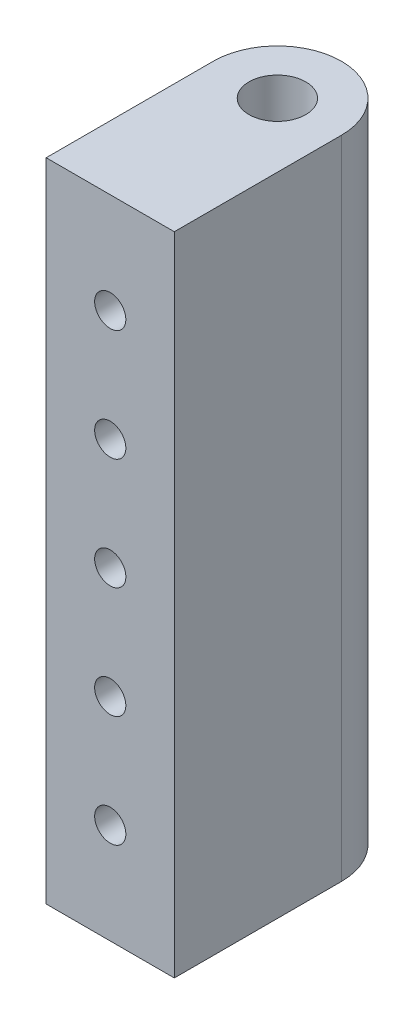
ISO-10303-21;
HEADER;
FILE_DESCRIPTION(('STEP AP214'),'2;1');
FILE_NAME('part.step','',(''),(''),'','','');
FILE_SCHEMA(('AUTOMOTIVE_DESIGN { 1 0 10303 214 1 1 1 1 }'));
ENDSEC;
DATA;
#1=APPLICATION_CONTEXT('core data for automotive mechanical design processes');
#2=APPLICATION_PROTOCOL_DEFINITION('international standard','automotive_design',2000,#1);
#3=PRODUCT_CONTEXT('',#1,'mechanical');
#4=PRODUCT('Part','Part','',(#3));
#5=PRODUCT_RELATED_PRODUCT_CATEGORY('part','',(#4));
#6=PRODUCT_DEFINITION_FORMATION('','',#4);
#7=PRODUCT_DEFINITION_CONTEXT('part definition',#1,'design');
#8=PRODUCT_DEFINITION('design','',#6,#7);
#9=PRODUCT_DEFINITION_SHAPE('','',#8);
#10=(LENGTH_UNIT() NAMED_UNIT(*) SI_UNIT(.MILLI.,.METRE.));
#11=(NAMED_UNIT(*) PLANE_ANGLE_UNIT() SI_UNIT($,.RADIAN.));
#12=(NAMED_UNIT(*) SI_UNIT($,.STERADIAN.) SOLID_ANGLE_UNIT());
#13=UNCERTAINTY_MEASURE_WITH_UNIT(LENGTH_MEASURE(1.E-05),#10,'distance_accuracy_value','');
#14=(GEOMETRIC_REPRESENTATION_CONTEXT(3) GLOBAL_UNCERTAINTY_ASSIGNED_CONTEXT((#13)) GLOBAL_UNIT_ASSIGNED_CONTEXT((#10,
#11,#12)) REPRESENTATION_CONTEXT('',''));
#15=CARTESIAN_POINT('',(0.,0.,0.));
#16=DIRECTION('',(0.,0.,1.));
#17=DIRECTION('',(1.,0.,0.));
#18=AXIS2_PLACEMENT_3D('',#15,#16,#17);
#19=CARTESIAN_POINT('',(0.,58.,0.));
#20=DIRECTION('',(0.,1.,0.));
#21=DIRECTION('',(0.,0.,1.));
#22=AXIS2_PLACEMENT_3D('',#19,#20,#21);
#23=PLANE('',#22);
#24=CARTESIAN_POINT('',(0.,58.,0.));
#25=DIRECTION('',(0.,1.,0.));
#26=DIRECTION('',(0.,0.,1.));
#27=AXIS2_PLACEMENT_3D('',#24,#25,#26);
#28=CIRCLE('',#27,5.75);
#29=CARTESIAN_POINT('',(5.75,58.,0.));
#30=VERTEX_POINT('',#29);
#31=CARTESIAN_POINT('',(-5.75,58.,0.));
#32=VERTEX_POINT('',#31);
#33=EDGE_CURVE('E87',#30,#32,#28,.T.);
#34=ORIENTED_EDGE('',*,*,#33,.T.);
#35=DIRECTION('',(0.,0.,1.));
#36=VECTOR('',#35,1.);
#37=CARTESIAN_POINT('',(-5.75,58.,0.));
#38=LINE('',#37,#36);
#39=CARTESIAN_POINT('',(-5.75,58.,15.));
#40=VERTEX_POINT('',#39);
#41=EDGE_CURVE('E82',#32,#40,#38,.T.);
#42=ORIENTED_EDGE('',*,*,#41,.T.);
#43=DIRECTION('',(1.,0.,0.));
#44=VECTOR('',#43,1.);
#45=CARTESIAN_POINT('',(-5.75,58.,15.));
#46=LINE('',#45,#44);
#47=CARTESIAN_POINT('',(5.75,58.,15.));
#48=VERTEX_POINT('',#47);
#49=EDGE_CURVE('E85',#40,#48,#46,.T.);
#50=ORIENTED_EDGE('',*,*,#49,.T.);
#51=DIRECTION('',(0.,0.,-1.));
#52=VECTOR('',#51,1.);
#53=CARTESIAN_POINT('',(5.75,58.,15.));
#54=LINE('',#53,#52);
#55=EDGE_CURVE('E52',#48,#30,#54,.T.);
#56=ORIENTED_EDGE('',*,*,#55,.T.);
#57=EDGE_LOOP('',(#34,#42,#50,#56));
#58=FACE_BOUND('',#57,.T.);
#59=CARTESIAN_POINT('',(0.,58.,0.));
#60=DIRECTION('',(0.,1.,0.));
#61=DIRECTION('',(0.,0.,1.));
#62=AXIS2_PLACEMENT_3D('',#59,#60,#61);
#63=CIRCLE('',#62,2.55);
#64=CARTESIAN_POINT('',(0.,58.,-2.55));
#65=VERTEX_POINT('',#64);
#66=EDGE_CURVE('E102',#65,#65,#63,.T.);
#67=ORIENTED_EDGE('',*,*,#66,.F.);
#68=EDGE_LOOP('',(#67));
#69=FACE_BOUND('',#68,.T.);
#70=ADVANCED_FACE('F35',(#58,#69),#23,.T.);
#71=CARTESIAN_POINT('',(0.,0.,0.));
#72=DIRECTION('',(0.,1.,0.));
#73=DIRECTION('',(0.,0.,1.));
#74=AXIS2_PLACEMENT_3D('',#71,#72,#73);
#75=PLANE('',#74);
#76=CARTESIAN_POINT('',(0.,0.,0.));
#77=DIRECTION('',(0.,1.,0.));
#78=DIRECTION('',(0.,0.,1.));
#79=AXIS2_PLACEMENT_3D('',#76,#77,#78);
#80=CIRCLE('',#79,5.75);
#81=CARTESIAN_POINT('',(5.75,0.,0.));
#82=VERTEX_POINT('',#81);
#83=CARTESIAN_POINT('',(-5.75,0.,0.));
#84=VERTEX_POINT('',#83);
#85=EDGE_CURVE('E99',#82,#84,#80,.T.);
#86=ORIENTED_EDGE('',*,*,#85,.F.);
#87=DIRECTION('',(0.,0.,-1.));
#88=VECTOR('',#87,1.);
#89=CARTESIAN_POINT('',(5.75,0.,15.));
#90=LINE('',#89,#88);
#91=CARTESIAN_POINT('',(5.75,0.,15.));
#92=VERTEX_POINT('',#91);
#93=EDGE_CURVE('E75',#92,#82,#90,.T.);
#94=ORIENTED_EDGE('',*,*,#93,.F.);
#95=DIRECTION('',(1.,0.,0.));
#96=VECTOR('',#95,1.);
#97=CARTESIAN_POINT('',(-5.75,0.,15.));
#98=LINE('',#97,#96);
#99=CARTESIAN_POINT('',(-5.75,0.,15.));
#100=VERTEX_POINT('',#99);
#101=EDGE_CURVE('E69',#100,#92,#98,.T.);
#102=ORIENTED_EDGE('',*,*,#101,.F.);
#103=DIRECTION('',(0.,0.,1.));
#104=VECTOR('',#103,1.);
#105=CARTESIAN_POINT('',(-5.75,0.,0.));
#106=LINE('',#105,#104);
#107=EDGE_CURVE('E91',#84,#100,#106,.T.);
#108=ORIENTED_EDGE('',*,*,#107,.F.);
#109=EDGE_LOOP('',(#86,#94,#102,#108));
#110=FACE_BOUND('',#109,.T.);
#111=CARTESIAN_POINT('',(0.,0.,0.));
#112=DIRECTION('',(0.,1.,0.));
#113=DIRECTION('',(0.,0.,1.));
#114=AXIS2_PLACEMENT_3D('',#111,#112,#113);
#115=CIRCLE('',#114,2.55);
#116=CARTESIAN_POINT('',(0.,0.,-2.55));
#117=VERTEX_POINT('',#116);
#118=EDGE_CURVE('E114',#117,#117,#115,.T.);
#119=ORIENTED_EDGE('',*,*,#118,.T.);
#120=EDGE_LOOP('',(#119));
#121=FACE_BOUND('',#120,.T.);
#122=ADVANCED_FACE('F110',(#110,#121),#75,.F.);
#123=CARTESIAN_POINT('',(0.,58.,0.));
#124=DIRECTION('',(0.,-1.,0.));
#125=DIRECTION('',(0.,0.,-1.));
#126=AXIS2_PLACEMENT_3D('',#123,#124,#125);
#127=CYLINDRICAL_SURFACE('',#126,5.75);
#128=ORIENTED_EDGE('',*,*,#85,.T.);
#129=DIRECTION('',(0.,-1.,0.));
#130=VECTOR('',#129,1.);
#131=CARTESIAN_POINT('',(-5.75,58.,0.));
#132=LINE('',#131,#130);
#133=EDGE_CURVE('E11',#32,#84,#132,.T.);
#134=ORIENTED_EDGE('',*,*,#133,.F.);
#135=ORIENTED_EDGE('',*,*,#33,.F.);
#136=DIRECTION('',(0.,-1.,0.));
#137=VECTOR('',#136,1.);
#138=CARTESIAN_POINT('',(5.75,58.,0.));
#139=LINE('',#138,#137);
#140=EDGE_CURVE('E95',#30,#82,#139,.T.);
#141=ORIENTED_EDGE('',*,*,#140,.T.);
#142=EDGE_LOOP('',(#128,#134,#135,#141));
#143=FACE_BOUND('',#142,.T.);
#144=ADVANCED_FACE('F37',(#143),#127,.T.);
#145=CARTESIAN_POINT('',(-5.75,58.,0.));
#146=DIRECTION('',(1.,0.,0.));
#147=DIRECTION('',(0.,0.,-1.));
#148=AXIS2_PLACEMENT_3D('',#145,#146,#147);
#149=PLANE('',#148);
#150=ORIENTED_EDGE('',*,*,#107,.T.);
#151=DIRECTION('',(0.,-1.,0.));
#152=VECTOR('',#151,1.);
#153=CARTESIAN_POINT('',(-5.75,58.,15.));
#154=LINE('',#153,#152);
#155=EDGE_CURVE('E44',#40,#100,#154,.T.);
#156=ORIENTED_EDGE('',*,*,#155,.F.);
#157=ORIENTED_EDGE('',*,*,#41,.F.);
#158=ORIENTED_EDGE('',*,*,#133,.T.);
#159=EDGE_LOOP('',(#150,#156,#157,#158));
#160=FACE_BOUND('',#159,.T.);
#161=ADVANCED_FACE('F90',(#160),#149,.F.);
#162=CARTESIAN_POINT('',(-5.75,58.,15.));
#163=DIRECTION('',(0.,0.,-1.));
#164=DIRECTION('',(-1.,0.,0.));
#165=AXIS2_PLACEMENT_3D('',#162,#163,#164);
#166=PLANE('',#165);
#167=CARTESIAN_POINT('',(0.,49.,15.));
#168=DIRECTION('',(0.,0.,1.));
#169=DIRECTION('',(1.,0.,0.));
#170=AXIS2_PLACEMENT_3D('',#167,#168,#169);
#171=CIRCLE('',#170,1.4);
#172=CARTESIAN_POINT('',(1.4,49.,15.));
#173=VERTEX_POINT('',#172);
#174=EDGE_CURVE('E144',#173,#173,#171,.T.);
#175=ORIENTED_EDGE('',*,*,#174,.F.);
#176=EDGE_LOOP('',(#175));
#177=FACE_BOUND('',#176,.T.);
#178=CARTESIAN_POINT('',(1.04999478503709E-13,39.,15.));
#179=DIRECTION('',(0.,0.,1.));
#180=DIRECTION('',(1.,0.,0.));
#181=AXIS2_PLACEMENT_3D('',#178,#179,#180);
#182=CIRCLE('',#181,1.4);
#183=CARTESIAN_POINT('',(1.4000000000001,39.,15.));
#184=VERTEX_POINT('',#183);
#185=EDGE_CURVE('E138',#184,#184,#182,.T.);
#186=ORIENTED_EDGE('',*,*,#185,.F.);
#187=EDGE_LOOP('',(#186));
#188=FACE_BOUND('',#187,.T.);
#189=CARTESIAN_POINT('',(2.09131595269429E-13,29.,15.));
#190=DIRECTION('',(0.,0.,1.));
#191=DIRECTION('',(1.,0.,0.));
#192=AXIS2_PLACEMENT_3D('',#189,#190,#191);
#193=CIRCLE('',#192,1.4);
#194=CARTESIAN_POINT('',(1.40000000000021,29.,15.));
#195=VERTEX_POINT('',#194);
#196=EDGE_CURVE('E132',#195,#195,#193,.T.);
#197=ORIENTED_EDGE('',*,*,#196,.F.);
#198=EDGE_LOOP('',(#197));
#199=FACE_BOUND('',#198,.T.);
#200=CARTESIAN_POINT('',(3.13263712035149E-13,19.,15.));
#201=DIRECTION('',(0.,0.,1.));
#202=DIRECTION('',(1.,0.,0.));
#203=AXIS2_PLACEMENT_3D('',#200,#201,#202);
#204=CIRCLE('',#203,1.4);
#205=CARTESIAN_POINT('',(1.40000000000031,19.,15.));
#206=VERTEX_POINT('',#205);
#207=EDGE_CURVE('E126',#206,#206,#204,.T.);
#208=ORIENTED_EDGE('',*,*,#207,.F.);
#209=EDGE_LOOP('',(#208));
#210=FACE_BOUND('',#209,.T.);
#211=CARTESIAN_POINT('',(4.1739582880087E-13,9.,15.));
#212=DIRECTION('',(0.,0.,1.));
#213=DIRECTION('',(1.,0.,0.));
#214=AXIS2_PLACEMENT_3D('',#211,#212,#213);
#215=CIRCLE('',#214,1.4);
#216=CARTESIAN_POINT('',(1.40000000000042,9.,15.));
#217=VERTEX_POINT('',#216);
#218=EDGE_CURVE('E120',#217,#217,#215,.T.);
#219=ORIENTED_EDGE('',*,*,#218,.F.);
#220=EDGE_LOOP('',(#219));
#221=FACE_BOUND('',#220,.T.);
#222=ORIENTED_EDGE('',*,*,#101,.T.);
#223=DIRECTION('',(0.,-1.,0.));
#224=VECTOR('',#223,1.);
#225=CARTESIAN_POINT('',(5.75,58.,15.));
#226=LINE('',#225,#224);
#227=EDGE_CURVE('E92',#48,#92,#226,.T.);
#228=ORIENTED_EDGE('',*,*,#227,.F.);
#229=ORIENTED_EDGE('',*,*,#49,.F.);
#230=ORIENTED_EDGE('',*,*,#155,.T.);
#231=EDGE_LOOP('',(#222,#228,#229,#230));
#232=FACE_BOUND('',#231,.T.);
#233=ADVANCED_FACE('F93',(#177,#188,#199,#210,#221,#232),#166,.F.);
#234=CARTESIAN_POINT('',(5.75,58.,15.));
#235=DIRECTION('',(-1.,0.,0.));
#236=DIRECTION('',(0.,0.,1.));
#237=AXIS2_PLACEMENT_3D('',#234,#235,#236);
#238=PLANE('',#237);
#239=ORIENTED_EDGE('',*,*,#93,.T.);
#240=ORIENTED_EDGE('',*,*,#140,.F.);
#241=ORIENTED_EDGE('',*,*,#55,.F.);
#242=ORIENTED_EDGE('',*,*,#227,.T.);
#243=EDGE_LOOP('',(#239,#240,#241,#242));
#244=FACE_BOUND('',#243,.T.);
#245=ADVANCED_FACE('F107',(#244),#238,.F.);
#246=CARTESIAN_POINT('',(0.,58.,0.));
#247=DIRECTION('',(0.,-1.,0.));
#248=DIRECTION('',(0.,0.,-1.));
#249=AXIS2_PLACEMENT_3D('',#246,#247,#248);
#250=CYLINDRICAL_SURFACE('',#249,2.55);
#251=CARTESIAN_POINT('',(0.,58.,-2.55));
#252=CARTESIAN_POINT('',(0.,57.3958333333333,-2.55));
#253=CARTESIAN_POINT('',(0.,56.7916666666667,-2.55));
#254=CARTESIAN_POINT('',(0.,55.5833333333333,-2.55));
#255=CARTESIAN_POINT('',(0.,54.9791666666667,-2.55));
#256=CARTESIAN_POINT('',(0.,53.7708333333333,-2.55));
#257=CARTESIAN_POINT('',(0.,53.1666666666667,-2.55));
#258=CARTESIAN_POINT('',(0.,51.9583333333333,-2.55));
#259=CARTESIAN_POINT('',(0.,51.3541666666667,-2.55));
#260=CARTESIAN_POINT('',(0.,50.1458333333333,-2.55));
#261=CARTESIAN_POINT('',(0.,49.5416666666667,-2.55));
#262=CARTESIAN_POINT('',(0.,48.3333333333333,-2.55));
#263=CARTESIAN_POINT('',(0.,47.7291666666667,-2.55));
#264=CARTESIAN_POINT('',(0.,46.5208333333333,-2.55));
#265=CARTESIAN_POINT('',(0.,45.9166666666667,-2.55));
#266=CARTESIAN_POINT('',(0.,44.7083333333333,-2.55));
#267=CARTESIAN_POINT('',(0.,44.1041666666667,-2.55));
#268=CARTESIAN_POINT('',(0.,42.8958333333333,-2.55));
#269=CARTESIAN_POINT('',(0.,42.2916666666667,-2.55));
#270=CARTESIAN_POINT('',(0.,41.0833333333333,-2.55));
#271=CARTESIAN_POINT('',(0.,40.4791666666667,-2.55));
#272=CARTESIAN_POINT('',(0.,39.2708333333333,-2.55));
#273=CARTESIAN_POINT('',(0.,38.6666666666667,-2.55));
#274=CARTESIAN_POINT('',(0.,37.4583333333333,-2.55));
#275=CARTESIAN_POINT('',(0.,36.8541666666667,-2.55));
#276=CARTESIAN_POINT('',(0.,35.6458333333333,-2.55));
#277=CARTESIAN_POINT('',(0.,35.0416666666667,-2.55));
#278=CARTESIAN_POINT('',(0.,33.8333333333333,-2.55));
#279=CARTESIAN_POINT('',(0.,33.2291666666667,-2.55));
#280=CARTESIAN_POINT('',(0.,32.0208333333333,-2.55));
#281=CARTESIAN_POINT('',(0.,31.4166666666667,-2.55));
#282=CARTESIAN_POINT('',(0.,30.2083333333333,-2.55));
#283=CARTESIAN_POINT('',(0.,29.6041666666667,-2.55));
#284=CARTESIAN_POINT('',(0.,28.3958333333333,-2.55));
#285=CARTESIAN_POINT('',(0.,27.7916666666667,-2.55));
#286=CARTESIAN_POINT('',(0.,26.5833333333333,-2.55));
#287=CARTESIAN_POINT('',(0.,25.9791666666667,-2.55));
#288=CARTESIAN_POINT('',(0.,24.7708333333333,-2.55));
#289=CARTESIAN_POINT('',(0.,24.1666666666667,-2.55));
#290=CARTESIAN_POINT('',(0.,22.9583333333333,-2.55));
#291=CARTESIAN_POINT('',(0.,22.3541666666667,-2.55));
#292=CARTESIAN_POINT('',(0.,21.1458333333333,-2.55));
#293=CARTESIAN_POINT('',(0.,20.5416666666667,-2.55));
#294=CARTESIAN_POINT('',(0.,19.3333333333333,-2.55));
#295=CARTESIAN_POINT('',(0.,18.7291666666667,-2.55));
#296=CARTESIAN_POINT('',(0.,17.5208333333333,-2.55));
#297=CARTESIAN_POINT('',(0.,16.9166666666667,-2.55));
#298=CARTESIAN_POINT('',(0.,15.7083333333333,-2.55));
#299=CARTESIAN_POINT('',(0.,15.1041666666667,-2.55));
#300=CARTESIAN_POINT('',(0.,13.8958333333333,-2.55));
#301=CARTESIAN_POINT('',(0.,13.2916666666667,-2.55));
#302=CARTESIAN_POINT('',(0.,12.0833333333333,-2.55));
#303=CARTESIAN_POINT('',(0.,11.4791666666667,-2.55));
#304=CARTESIAN_POINT('',(0.,10.2708333333333,-2.55));
#305=CARTESIAN_POINT('',(0.,9.66666666666667,-2.55));
#306=CARTESIAN_POINT('',(0.,8.45833333333333,-2.55));
#307=CARTESIAN_POINT('',(0.,7.85416666666667,-2.55));
#308=CARTESIAN_POINT('',(0.,6.64583333333333,-2.55));
#309=CARTESIAN_POINT('',(0.,6.04166666666667,-2.55));
#310=CARTESIAN_POINT('',(0.,4.83333333333333,-2.55));
#311=CARTESIAN_POINT('',(0.,4.22916666666667,-2.55));
#312=CARTESIAN_POINT('',(0.,3.02083333333334,-2.55));
#313=CARTESIAN_POINT('',(0.,2.41666666666667,-2.55));
#314=CARTESIAN_POINT('',(0.,1.20833333333333,-2.55));
#315=CARTESIAN_POINT('',(0.,0.604166666666666,-2.55));
#316=CARTESIAN_POINT('',(0.,0.,-2.55));
#317=B_SPLINE_CURVE_WITH_KNOTS('',3,(#251,#252,#253,#254,#255,#256,#257,#258,#259,#260,#261,
#262,#263,#264,#265,#266,#267,#268,#269,#270,#271,#272,#273,#274,#275,#276,#277,#278,#279,#280,
#281,#282,#283,#284,#285,#286,#287,#288,#289,#290,#291,#292,#293,#294,#295,#296,#297,#298,#299,
#300,#301,#302,#303,#304,#305,#306,#307,#308,#309,#310,#311,#312,#313,#314,#315,#316),
.UNSPECIFIED.,.F.,.F.,(4,2,2,2,2,2,2,2,2,2,2,2,2,2,2,2,2,2,2,2,2,2,2,2,2,2,2,2,2,2,2,2,4),(0.,
1.81249999999999,3.625,5.4375,7.24999999999999,9.06249999999999,10.875,12.6875,14.5,16.3125,
18.125,19.9375,21.75,23.5625,25.375,27.1875,29.,30.8125,32.625,34.4375,36.25,38.0625,39.875,
41.6875,43.5,45.3125,47.125,48.9375,50.75,52.5625,54.375,56.1875,58.),.UNSPECIFIED.);
#318=EDGE_CURVE('BSEAM173',#65,#117,#317,.T.);
#319=ORIENTED_EDGE('',*,*,#66,.T.);
#320=ORIENTED_EDGE('',*,*,#118,.F.);
#321=ORIENTED_EDGE('',*,*,#318,.T.);
#322=ORIENTED_EDGE('',*,*,#318,.F.);
#323=EDGE_LOOP('',(#319,#321,#320,#322));
#324=FACE_BOUND('',#323,.T.);
#325=ADVANCED_FACE('F173',(#324),#250,.F.);
#326=CARTESIAN_POINT('',(4.1739582880087E-13,9.,5.));
#327=DIRECTION('',(0.,0.,1.));
#328=DIRECTION('',(1.,0.,0.));
#329=AXIS2_PLACEMENT_3D('',#326,#327,#328);
#330=CYLINDRICAL_SURFACE('',#329,1.4);
#331=CARTESIAN_POINT('',(4.1739582880087E-13,9.,5.));
#332=DIRECTION('',(0.,0.,1.));
#333=DIRECTION('',(1.,0.,0.));
#334=AXIS2_PLACEMENT_3D('',#331,#332,#333);
#335=CIRCLE('',#334,1.4);
#336=CARTESIAN_POINT('',(1.40000000000042,9.,5.));
#337=VERTEX_POINT('',#336);
#338=EDGE_CURVE('E123',#337,#337,#335,.T.);
#339=ORIENTED_EDGE('',*,*,#338,.F.);
#340=EDGE_LOOP('',(#339));
#341=FACE_BOUND('',#340,.T.);
#342=ORIENTED_EDGE('',*,*,#218,.T.);
#343=EDGE_LOOP('',(#342));
#344=FACE_BOUND('',#343,.T.);
#345=ADVANCED_FACE('F170',(#341,#344),#330,.F.);
#346=CARTESIAN_POINT('',(4.1739582880087E-13,9.,5.));
#347=DIRECTION('',(0.,0.,1.));
#348=DIRECTION('',(1.,0.,0.));
#349=AXIS2_PLACEMENT_3D('',#346,#347,#348);
#350=PLANE('',#349);
#351=ORIENTED_EDGE('',*,*,#338,.T.);
#352=EDGE_LOOP('',(#351));
#353=FACE_BOUND('',#352,.T.);
#354=ADVANCED_FACE('F172',(#353),#350,.T.);
#355=CARTESIAN_POINT('',(3.13263712035149E-13,19.,5.));
#356=DIRECTION('',(0.,0.,1.));
#357=DIRECTION('',(1.,0.,0.));
#358=AXIS2_PLACEMENT_3D('',#355,#356,#357);
#359=CYLINDRICAL_SURFACE('',#358,1.4);
#360=CARTESIAN_POINT('',(3.13263712035149E-13,19.,5.));
#361=DIRECTION('',(0.,0.,1.));
#362=DIRECTION('',(1.,0.,0.));
#363=AXIS2_PLACEMENT_3D('',#360,#361,#362);
#364=CIRCLE('',#363,1.4);
#365=CARTESIAN_POINT('',(1.40000000000031,19.,5.));
#366=VERTEX_POINT('',#365);
#367=EDGE_CURVE('E129',#366,#366,#364,.T.);
#368=ORIENTED_EDGE('',*,*,#367,.F.);
#369=EDGE_LOOP('',(#368));
#370=FACE_BOUND('',#369,.T.);
#371=ORIENTED_EDGE('',*,*,#207,.T.);
#372=EDGE_LOOP('',(#371));
#373=FACE_BOUND('',#372,.T.);
#374=ADVANCED_FACE('F180',(#370,#373),#359,.F.);
#375=CARTESIAN_POINT('',(3.13263712035149E-13,19.,5.));
#376=DIRECTION('',(0.,0.,1.));
#377=DIRECTION('',(1.,0.,0.));
#378=AXIS2_PLACEMENT_3D('',#375,#376,#377);
#379=PLANE('',#378);
#380=ORIENTED_EDGE('',*,*,#367,.T.);
#381=EDGE_LOOP('',(#380));
#382=FACE_BOUND('',#381,.T.);
#383=ADVANCED_FACE('F248',(#382),#379,.T.);
#384=CARTESIAN_POINT('',(2.09131595269429E-13,29.,5.));
#385=DIRECTION('',(0.,0.,1.));
#386=DIRECTION('',(1.,0.,0.));
#387=AXIS2_PLACEMENT_3D('',#384,#385,#386);
#388=CYLINDRICAL_SURFACE('',#387,1.4);
#389=CARTESIAN_POINT('',(2.09131595269429E-13,29.,5.));
#390=DIRECTION('',(0.,0.,1.));
#391=DIRECTION('',(1.,0.,0.));
#392=AXIS2_PLACEMENT_3D('',#389,#390,#391);
#393=CIRCLE('',#392,1.4);
#394=CARTESIAN_POINT('',(1.40000000000021,29.,5.));
#395=VERTEX_POINT('',#394);
#396=EDGE_CURVE('E135',#395,#395,#393,.T.);
#397=ORIENTED_EDGE('',*,*,#396,.F.);
#398=EDGE_LOOP('',(#397));
#399=FACE_BOUND('',#398,.T.);
#400=ORIENTED_EDGE('',*,*,#196,.T.);
#401=EDGE_LOOP('',(#400));
#402=FACE_BOUND('',#401,.T.);
#403=ADVANCED_FACE('F257',(#399,#402),#388,.F.);
#404=CARTESIAN_POINT('',(2.09131595269429E-13,29.,5.));
#405=DIRECTION('',(0.,0.,1.));
#406=DIRECTION('',(1.,0.,0.));
#407=AXIS2_PLACEMENT_3D('',#404,#405,#406);
#408=PLANE('',#407);
#409=ORIENTED_EDGE('',*,*,#396,.T.);
#410=EDGE_LOOP('',(#409));
#411=FACE_BOUND('',#410,.T.);
#412=ADVANCED_FACE('F266',(#411),#408,.T.);
#413=CARTESIAN_POINT('',(1.04999478503709E-13,39.,5.));
#414=DIRECTION('',(0.,0.,1.));
#415=DIRECTION('',(1.,0.,0.));
#416=AXIS2_PLACEMENT_3D('',#413,#414,#415);
#417=CYLINDRICAL_SURFACE('',#416,1.4);
#418=CARTESIAN_POINT('',(1.04999478503709E-13,39.,5.));
#419=DIRECTION('',(0.,0.,1.));
#420=DIRECTION('',(1.,0.,0.));
#421=AXIS2_PLACEMENT_3D('',#418,#419,#420);
#422=CIRCLE('',#421,1.4);
#423=CARTESIAN_POINT('',(1.4000000000001,39.,5.));
#424=VERTEX_POINT('',#423);
#425=EDGE_CURVE('E141',#424,#424,#422,.T.);
#426=ORIENTED_EDGE('',*,*,#425,.F.);
#427=EDGE_LOOP('',(#426));
#428=FACE_BOUND('',#427,.T.);
#429=ORIENTED_EDGE('',*,*,#185,.T.);
#430=EDGE_LOOP('',(#429));
#431=FACE_BOUND('',#430,.T.);
#432=ADVANCED_FACE('F275',(#428,#431),#417,.F.);
#433=CARTESIAN_POINT('',(1.04999478503709E-13,39.,5.));
#434=DIRECTION('',(0.,0.,1.));
#435=DIRECTION('',(1.,0.,0.));
#436=AXIS2_PLACEMENT_3D('',#433,#434,#435);
#437=PLANE('',#436);
#438=ORIENTED_EDGE('',*,*,#425,.T.);
#439=EDGE_LOOP('',(#438));
#440=FACE_BOUND('',#439,.T.);
#441=ADVANCED_FACE('F155',(#440),#437,.T.);
#442=CARTESIAN_POINT('',(0.,49.,5.));
#443=DIRECTION('',(0.,0.,1.));
#444=DIRECTION('',(1.,0.,0.));
#445=AXIS2_PLACEMENT_3D('',#442,#443,#444);
#446=CYLINDRICAL_SURFACE('',#445,1.4);
#447=CARTESIAN_POINT('',(0.,49.,5.));
#448=DIRECTION('',(0.,0.,1.));
#449=DIRECTION('',(1.,0.,0.));
#450=AXIS2_PLACEMENT_3D('',#447,#448,#449);
#451=CIRCLE('',#450,1.4);
#452=CARTESIAN_POINT('',(1.4,49.,5.));
#453=VERTEX_POINT('',#452);
#454=EDGE_CURVE('E117',#453,#453,#451,.T.);
#455=ORIENTED_EDGE('',*,*,#454,.F.);
#456=EDGE_LOOP('',(#455));
#457=FACE_BOUND('',#456,.T.);
#458=ORIENTED_EDGE('',*,*,#174,.T.);
#459=EDGE_LOOP('',(#458));
#460=FACE_BOUND('',#459,.T.);
#461=ADVANCED_FACE('F152',(#457,#460),#446,.F.);
#462=CARTESIAN_POINT('',(0.,49.,5.));
#463=DIRECTION('',(0.,0.,1.));
#464=DIRECTION('',(1.,0.,0.));
#465=AXIS2_PLACEMENT_3D('',#462,#463,#464);
#466=PLANE('',#465);
#467=ORIENTED_EDGE('',*,*,#454,.T.);
#468=EDGE_LOOP('',(#467));
#469=FACE_BOUND('',#468,.T.);
#470=ADVANCED_FACE('F150',(#469),#466,.T.);
#471=CLOSED_SHELL('',(#70,#122,#144,#161,#233,#245,#325,#345,#354,#374,#383,#403,#412,#432,#441,
#461,#470));
#472=MANIFOLD_SOLID_BREP('B2',#471);
#473=ADVANCED_BREP_SHAPE_REPRESENTATION('',(#18,#472),#14);
#474=SHAPE_DEFINITION_REPRESENTATION(#9,#473);
ENDSEC;
END-ISO-10303-21;
